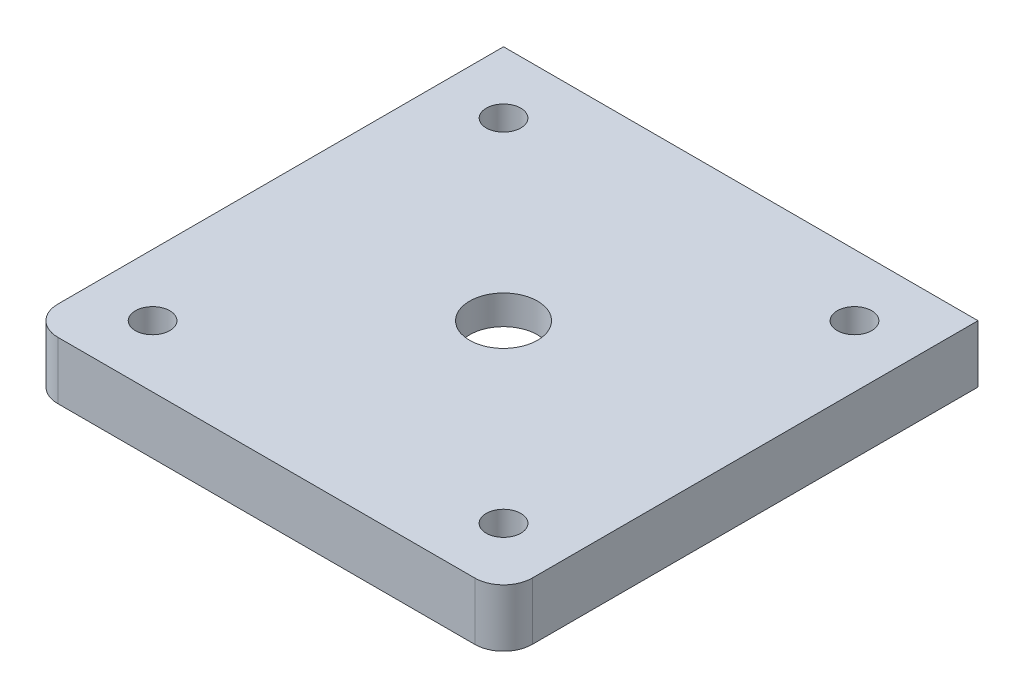
ISO-10303-21;
HEADER;
FILE_DESCRIPTION(('STEP AP214'),'2;1');
FILE_NAME('part.step','',(''),(''),'','','');
FILE_SCHEMA(('AUTOMOTIVE_DESIGN { 1 0 10303 214 1 1 1 1 }'));
ENDSEC;
DATA;
#1=APPLICATION_CONTEXT('core data for automotive mechanical design processes');
#2=APPLICATION_PROTOCOL_DEFINITION('international standard','automotive_design',2000,#1);
#3=PRODUCT_CONTEXT('',#1,'mechanical');
#4=PRODUCT('Part','Part','',(#3));
#5=PRODUCT_RELATED_PRODUCT_CATEGORY('part','',(#4));
#6=PRODUCT_DEFINITION_FORMATION('','',#4);
#7=PRODUCT_DEFINITION_CONTEXT('part definition',#1,'design');
#8=PRODUCT_DEFINITION('design','',#6,#7);
#9=PRODUCT_DEFINITION_SHAPE('','',#8);
#10=(LENGTH_UNIT() NAMED_UNIT(*) SI_UNIT(.MILLI.,.METRE.));
#11=(NAMED_UNIT(*) PLANE_ANGLE_UNIT() SI_UNIT($,.RADIAN.));
#12=(NAMED_UNIT(*) SI_UNIT($,.STERADIAN.) SOLID_ANGLE_UNIT());
#13=UNCERTAINTY_MEASURE_WITH_UNIT(LENGTH_MEASURE(1.E-05),#10,'distance_accuracy_value','');
#14=(GEOMETRIC_REPRESENTATION_CONTEXT(3) GLOBAL_UNCERTAINTY_ASSIGNED_CONTEXT((#13)) GLOBAL_UNIT_ASSIGNED_CONTEXT((#10,
#11,#12)) REPRESENTATION_CONTEXT('',''));
#15=CARTESIAN_POINT('',(0.,0.,0.));
#16=DIRECTION('',(0.,0.,1.));
#17=DIRECTION('',(1.,0.,0.));
#18=AXIS2_PLACEMENT_3D('',#15,#16,#17);
#19=CARTESIAN_POINT('',(0.,5.08,0.));
#20=DIRECTION('',(0.,1.,0.));
#21=DIRECTION('',(0.,0.,1.));
#22=AXIS2_PLACEMENT_3D('',#19,#20,#21);
#23=PLANE('',#22);
#24=DIRECTION('',(1.,0.,0.));
#25=VECTOR('',#24,1.);
#26=CARTESIAN_POINT('',(0.,5.08,-20.955));
#27=LINE('',#26,#25);
#28=CARTESIAN_POINT('',(-20.955,5.08,-20.955));
#29=VERTEX_POINT('',#28);
#30=CARTESIAN_POINT('',(20.955,5.08,-20.955));
#31=VERTEX_POINT('',#30);
#32=EDGE_CURVE('E93',#29,#31,#27,.T.);
#33=ORIENTED_EDGE('',*,*,#32,.F.);
#34=DIRECTION('',(0.,0.,1.));
#35=VECTOR('',#34,1.);
#36=CARTESIAN_POINT('',(-20.955,5.08,-20.955));
#37=LINE('',#36,#35);
#38=CARTESIAN_POINT('',(-20.955,5.08,18.415));
#39=VERTEX_POINT('',#38);
#40=EDGE_CURVE('E52',#29,#39,#37,.T.);
#41=ORIENTED_EDGE('',*,*,#40,.T.);
#42=CARTESIAN_POINT('',(-18.415,5.08,18.415));
#43=DIRECTION('',(0.,1.,0.));
#44=DIRECTION('',(0.,0.,1.));
#45=AXIS2_PLACEMENT_3D('',#42,#43,#44);
#46=CIRCLE('',#45,2.54);
#47=CARTESIAN_POINT('',(-18.415,5.08,20.955));
#48=VERTEX_POINT('',#47);
#49=EDGE_CURVE('E136',#39,#48,#46,.T.);
#50=ORIENTED_EDGE('',*,*,#49,.T.);
#51=DIRECTION('',(1.,0.,0.));
#52=VECTOR('',#51,1.);
#53=CARTESIAN_POINT('',(-20.955,5.08,20.955));
#54=LINE('',#53,#52);
#55=CARTESIAN_POINT('',(18.415,5.08,20.955));
#56=VERTEX_POINT('',#55);
#57=EDGE_CURVE('E110',#48,#56,#54,.T.);
#58=ORIENTED_EDGE('',*,*,#57,.T.);
#59=CARTESIAN_POINT('',(18.415,5.08,18.415));
#60=DIRECTION('',(0.,1.,0.));
#61=DIRECTION('',(0.,0.,1.));
#62=AXIS2_PLACEMENT_3D('',#59,#60,#61);
#63=CIRCLE('',#62,2.54);
#64=CARTESIAN_POINT('',(20.955,5.08,18.415));
#65=VERTEX_POINT('',#64);
#66=EDGE_CURVE('E45',#56,#65,#63,.T.);
#67=ORIENTED_EDGE('',*,*,#66,.T.);
#68=DIRECTION('',(0.,0.,-1.));
#69=VECTOR('',#68,1.);
#70=CARTESIAN_POINT('',(20.955,5.08,-20.955));
#71=LINE('',#70,#69);
#72=EDGE_CURVE('E104',#65,#31,#71,.T.);
#73=ORIENTED_EDGE('',*,*,#72,.T.);
#74=EDGE_LOOP('',(#33,#41,#50,#58,#67,#73));
#75=FACE_BOUND('',#74,.T.);
#76=CARTESIAN_POINT('',(0.,5.08,0.));
#77=DIRECTION('',(0.,-1.,0.));
#78=DIRECTION('',(0.,0.,-1.));
#79=AXIS2_PLACEMENT_3D('',#76,#77,#78);
#80=CIRCLE('',#79,3.);
#81=CARTESIAN_POINT('',(0.,5.08,-3.));
#82=VERTEX_POINT('',#81);
#83=EDGE_CURVE('E296',#82,#82,#80,.T.);
#84=ORIENTED_EDGE('',*,*,#83,.T.);
#85=EDGE_LOOP('',(#84));
#86=FACE_BOUND('',#85,.T.);
#87=CARTESIAN_POINT('',(15.5,5.08,15.5));
#88=DIRECTION('',(0.,1.,0.));
#89=DIRECTION('',(0.,0.,1.));
#90=AXIS2_PLACEMENT_3D('',#87,#88,#89);
#91=CIRCLE('',#90,1.52400000000001);
#92=CARTESIAN_POINT('',(15.5,5.08,17.024));
#93=VERTEX_POINT('',#92);
#94=EDGE_CURVE('E317',#93,#93,#91,.T.);
#95=ORIENTED_EDGE('',*,*,#94,.F.);
#96=EDGE_LOOP('',(#95));
#97=FACE_BOUND('',#96,.T.);
#98=CARTESIAN_POINT('',(-15.5,5.08,-15.5));
#99=DIRECTION('',(0.,1.,0.));
#100=DIRECTION('',(0.,0.,1.));
#101=AXIS2_PLACEMENT_3D('',#98,#99,#100);
#102=CIRCLE('',#101,1.524);
#103=CARTESIAN_POINT('',(-15.5,5.08,-13.976));
#104=VERTEX_POINT('',#103);
#105=EDGE_CURVE('E121',#104,#104,#102,.T.);
#106=ORIENTED_EDGE('',*,*,#105,.F.);
#107=EDGE_LOOP('',(#106));
#108=FACE_BOUND('',#107,.T.);
#109=CARTESIAN_POINT('',(15.5,5.08,-15.5));
#110=DIRECTION('',(0.,1.,0.));
#111=DIRECTION('',(0.,0.,-1.));
#112=AXIS2_PLACEMENT_3D('',#109,#110,#111);
#113=CIRCLE('',#112,1.52400000000001);
#114=CARTESIAN_POINT('',(15.5,5.08,-17.024));
#115=VERTEX_POINT('',#114);
#116=EDGE_CURVE('E323',#115,#115,#113,.T.);
#117=ORIENTED_EDGE('',*,*,#116,.F.);
#118=EDGE_LOOP('',(#117));
#119=FACE_BOUND('',#118,.T.);
#120=CARTESIAN_POINT('',(-15.5,5.08,15.5));
#121=DIRECTION('',(0.,1.,0.));
#122=DIRECTION('',(0.,0.,-1.));
#123=AXIS2_PLACEMENT_3D('',#120,#121,#122);
#124=CIRCLE('',#123,1.524);
#125=CARTESIAN_POINT('',(-15.5,5.08,13.976));
#126=VERTEX_POINT('',#125);
#127=EDGE_CURVE('E311',#126,#126,#124,.T.);
#128=ORIENTED_EDGE('',*,*,#127,.F.);
#129=EDGE_LOOP('',(#128));
#130=FACE_BOUND('',#129,.T.);
#131=ADVANCED_FACE('F37',(#75,#86,#97,#108,#119,#130),#23,.T.);
#132=CARTESIAN_POINT('',(0.,0.,0.));
#133=DIRECTION('',(0.,1.,0.));
#134=DIRECTION('',(0.,0.,1.));
#135=AXIS2_PLACEMENT_3D('',#132,#133,#134);
#136=PLANE('',#135);
#137=CARTESIAN_POINT('',(0.,0.,0.));
#138=DIRECTION('',(0.,-1.,0.));
#139=DIRECTION('',(0.,0.,-1.));
#140=AXIS2_PLACEMENT_3D('',#137,#138,#139);
#141=CIRCLE('',#140,11.5);
#142=CARTESIAN_POINT('',(0.,0.,-11.5));
#143=VERTEX_POINT('',#142);
#144=EDGE_CURVE('E301',#143,#143,#141,.T.);
#145=ORIENTED_EDGE('',*,*,#144,.F.);
#146=EDGE_LOOP('',(#145));
#147=FACE_BOUND('',#146,.T.);
#148=DIRECTION('',(0.,0.,-1.));
#149=VECTOR('',#148,1.);
#150=CARTESIAN_POINT('',(20.955,0.,-20.955));
#151=LINE('',#150,#149);
#152=CARTESIAN_POINT('',(20.955,0.,18.415));
#153=VERTEX_POINT('',#152);
#154=CARTESIAN_POINT('',(20.955,0.,-20.955));
#155=VERTEX_POINT('',#154);
#156=EDGE_CURVE('E118',#153,#155,#151,.T.);
#157=ORIENTED_EDGE('',*,*,#156,.F.);
#158=CARTESIAN_POINT('',(18.415,0.,18.415));
#159=DIRECTION('',(0.,1.,0.));
#160=DIRECTION('',(0.,0.,1.));
#161=AXIS2_PLACEMENT_3D('',#158,#159,#160);
#162=CIRCLE('',#161,2.54);
#163=CARTESIAN_POINT('',(18.415,0.,20.955));
#164=VERTEX_POINT('',#163);
#165=EDGE_CURVE('E130',#153,#164,#162,.F.);
#166=ORIENTED_EDGE('',*,*,#165,.T.);
#167=DIRECTION('',(1.,0.,0.));
#168=VECTOR('',#167,1.);
#169=CARTESIAN_POINT('',(-20.955,0.,20.955));
#170=LINE('',#169,#168);
#171=CARTESIAN_POINT('',(-18.415,0.,20.955));
#172=VERTEX_POINT('',#171);
#173=EDGE_CURVE('E114',#172,#164,#170,.T.);
#174=ORIENTED_EDGE('',*,*,#173,.F.);
#175=CARTESIAN_POINT('',(-18.415,0.,18.415));
#176=DIRECTION('',(0.,1.,0.));
#177=DIRECTION('',(0.,0.,1.));
#178=AXIS2_PLACEMENT_3D('',#175,#176,#177);
#179=CIRCLE('',#178,2.54);
#180=CARTESIAN_POINT('',(-20.955,0.,18.415));
#181=VERTEX_POINT('',#180);
#182=EDGE_CURVE('E128',#172,#181,#179,.F.);
#183=ORIENTED_EDGE('',*,*,#182,.T.);
#184=DIRECTION('',(0.,0.,1.));
#185=VECTOR('',#184,1.);
#186=CARTESIAN_POINT('',(-20.955,0.,-20.955));
#187=LINE('',#186,#185);
#188=CARTESIAN_POINT('',(-20.955,0.,-20.955));
#189=VERTEX_POINT('',#188);
#190=EDGE_CURVE('E123',#189,#181,#187,.T.);
#191=ORIENTED_EDGE('',*,*,#190,.F.);
#192=DIRECTION('',(-1.,0.,0.));
#193=VECTOR('',#192,1.);
#194=CARTESIAN_POINT('',(-20.955,0.,-20.955));
#195=LINE('',#194,#193);
#196=EDGE_CURVE('E96',#155,#189,#195,.T.);
#197=ORIENTED_EDGE('',*,*,#196,.F.);
#198=EDGE_LOOP('',(#157,#166,#174,#183,#191,#197));
#199=FACE_BOUND('',#198,.T.);
#200=CARTESIAN_POINT('',(-15.5,0.,-15.5));
#201=DIRECTION('',(0.,1.,0.));
#202=DIRECTION('',(0.,0.,1.));
#203=AXIS2_PLACEMENT_3D('',#200,#201,#202);
#204=CIRCLE('',#203,1.524);
#205=CARTESIAN_POINT('',(-15.5,0.,-13.976));
#206=VERTEX_POINT('',#205);
#207=EDGE_CURVE('E326',#206,#206,#204,.T.);
#208=ORIENTED_EDGE('',*,*,#207,.T.);
#209=EDGE_LOOP('',(#208));
#210=FACE_BOUND('',#209,.T.);
#211=CARTESIAN_POINT('',(15.5,0.,-15.5));
#212=DIRECTION('',(0.,1.,0.));
#213=DIRECTION('',(0.,0.,-1.));
#214=AXIS2_PLACEMENT_3D('',#211,#212,#213);
#215=CIRCLE('',#214,1.52400000000001);
#216=CARTESIAN_POINT('',(15.5,0.,-17.024));
#217=VERTEX_POINT('',#216);
#218=EDGE_CURVE('E320',#217,#217,#215,.T.);
#219=ORIENTED_EDGE('',*,*,#218,.T.);
#220=EDGE_LOOP('',(#219));
#221=FACE_BOUND('',#220,.T.);
#222=CARTESIAN_POINT('',(15.5,0.,15.5));
#223=DIRECTION('',(0.,1.,0.));
#224=DIRECTION('',(0.,0.,1.));
#225=AXIS2_PLACEMENT_3D('',#222,#223,#224);
#226=CIRCLE('',#225,1.52400000000001);
#227=CARTESIAN_POINT('',(15.5,0.,17.024));
#228=VERTEX_POINT('',#227);
#229=EDGE_CURVE('E314',#228,#228,#226,.T.);
#230=ORIENTED_EDGE('',*,*,#229,.T.);
#231=EDGE_LOOP('',(#230));
#232=FACE_BOUND('',#231,.T.);
#233=CARTESIAN_POINT('',(-15.5,0.,15.5));
#234=DIRECTION('',(0.,1.,0.));
#235=DIRECTION('',(0.,0.,-1.));
#236=AXIS2_PLACEMENT_3D('',#233,#234,#235);
#237=CIRCLE('',#236,1.524);
#238=CARTESIAN_POINT('',(-15.5,0.,13.976));
#239=VERTEX_POINT('',#238);
#240=EDGE_CURVE('E308',#239,#239,#237,.T.);
#241=ORIENTED_EDGE('',*,*,#240,.T.);
#242=EDGE_LOOP('',(#241));
#243=FACE_BOUND('',#242,.T.);
#244=ADVANCED_FACE('F146',(#147,#199,#210,#221,#232,#243),#136,.F.);
#245=CARTESIAN_POINT('',(20.955,5.08,-20.955));
#246=DIRECTION('',(-1.,0.,0.));
#247=DIRECTION('',(0.,0.,1.));
#248=AXIS2_PLACEMENT_3D('',#245,#246,#247);
#249=PLANE('',#248);
#250=ORIENTED_EDGE('',*,*,#156,.T.);
#251=DIRECTION('',(0.,1.,0.));
#252=VECTOR('',#251,1.);
#253=CARTESIAN_POINT('',(20.955,5.08,-20.955));
#254=LINE('',#253,#252);
#255=EDGE_CURVE('E105',#155,#31,#254,.T.);
#256=ORIENTED_EDGE('',*,*,#255,.T.);
#257=ORIENTED_EDGE('',*,*,#72,.F.);
#258=DIRECTION('',(0.,-1.,0.));
#259=VECTOR('',#258,1.);
#260=CARTESIAN_POINT('',(20.955,5.08,18.415));
#261=LINE('',#260,#259);
#262=EDGE_CURVE('E112',#65,#153,#261,.T.);
#263=ORIENTED_EDGE('',*,*,#262,.T.);
#264=EDGE_LOOP('',(#250,#256,#257,#263));
#265=FACE_BOUND('',#264,.T.);
#266=ADVANCED_FACE('F141',(#265),#249,.F.);
#267=CARTESIAN_POINT('',(-20.955,5.08,-20.955));
#268=DIRECTION('',(1.,0.,0.));
#269=DIRECTION('',(0.,0.,-1.));
#270=AXIS2_PLACEMENT_3D('',#267,#268,#269);
#271=PLANE('',#270);
#272=ORIENTED_EDGE('',*,*,#40,.F.);
#273=DIRECTION('',(0.,-1.,0.));
#274=VECTOR('',#273,1.);
#275=CARTESIAN_POINT('',(-20.955,5.08,-20.955));
#276=LINE('',#275,#274);
#277=EDGE_CURVE('E91',#29,#189,#276,.T.);
#278=ORIENTED_EDGE('',*,*,#277,.T.);
#279=ORIENTED_EDGE('',*,*,#190,.T.);
#280=DIRECTION('',(0.,-1.,0.));
#281=VECTOR('',#280,1.);
#282=CARTESIAN_POINT('',(-20.955,5.08,18.415));
#283=LINE('',#282,#281);
#284=EDGE_CURVE('E11',#181,#39,#283,.F.);
#285=ORIENTED_EDGE('',*,*,#284,.T.);
#286=EDGE_LOOP('',(#272,#278,#279,#285));
#287=FACE_BOUND('',#286,.T.);
#288=ADVANCED_FACE('F107',(#287),#271,.F.);
#289=CARTESIAN_POINT('',(-20.955,5.08,20.955));
#290=DIRECTION('',(0.,0.,-1.));
#291=DIRECTION('',(-1.,0.,0.));
#292=AXIS2_PLACEMENT_3D('',#289,#290,#291);
#293=PLANE('',#292);
#294=ORIENTED_EDGE('',*,*,#173,.T.);
#295=DIRECTION('',(0.,-1.,0.));
#296=VECTOR('',#295,1.);
#297=CARTESIAN_POINT('',(18.415,5.08,20.955));
#298=LINE('',#297,#296);
#299=EDGE_CURVE('E59',#164,#56,#298,.F.);
#300=ORIENTED_EDGE('',*,*,#299,.T.);
#301=ORIENTED_EDGE('',*,*,#57,.F.);
#302=DIRECTION('',(0.,-1.,0.));
#303=VECTOR('',#302,1.);
#304=CARTESIAN_POINT('',(-18.415,5.08,20.955));
#305=LINE('',#304,#303);
#306=EDGE_CURVE('E132',#48,#172,#305,.T.);
#307=ORIENTED_EDGE('',*,*,#306,.T.);
#308=EDGE_LOOP('',(#294,#300,#301,#307));
#309=FACE_BOUND('',#308,.T.);
#310=ADVANCED_FACE('F148',(#309),#293,.F.);
#311=CARTESIAN_POINT('',(-15.5,5.08,-15.5));
#312=DIRECTION('',(0.,-1.,0.));
#313=DIRECTION('',(0.,0.,-1.));
#314=AXIS2_PLACEMENT_3D('',#311,#312,#313);
#315=CYLINDRICAL_SURFACE('',#314,1.524);
#316=ORIENTED_EDGE('',*,*,#105,.T.);
#317=EDGE_LOOP('',(#316));
#318=FACE_BOUND('',#317,.T.);
#319=ORIENTED_EDGE('',*,*,#207,.F.);
#320=EDGE_LOOP('',(#319));
#321=FACE_BOUND('',#320,.T.);
#322=ADVANCED_FACE('F166',(#318,#321),#315,.F.);
#323=CARTESIAN_POINT('',(15.5,5.08,-15.5));
#324=DIRECTION('',(0.,-1.,0.));
#325=DIRECTION('',(0.,0.,-1.));
#326=AXIS2_PLACEMENT_3D('',#323,#324,#325);
#327=CYLINDRICAL_SURFACE('',#326,1.52400000000001);
#328=ORIENTED_EDGE('',*,*,#116,.T.);
#329=EDGE_LOOP('',(#328));
#330=FACE_BOUND('',#329,.T.);
#331=ORIENTED_EDGE('',*,*,#218,.F.);
#332=EDGE_LOOP('',(#331));
#333=FACE_BOUND('',#332,.T.);
#334=ADVANCED_FACE('F195',(#330,#333),#327,.F.);
#335=CARTESIAN_POINT('',(15.5,5.08,15.5));
#336=DIRECTION('',(0.,-1.,0.));
#337=DIRECTION('',(0.,0.,-1.));
#338=AXIS2_PLACEMENT_3D('',#335,#336,#337);
#339=CYLINDRICAL_SURFACE('',#338,1.52400000000001);
#340=ORIENTED_EDGE('',*,*,#94,.T.);
#341=EDGE_LOOP('',(#340));
#342=FACE_BOUND('',#341,.T.);
#343=ORIENTED_EDGE('',*,*,#229,.F.);
#344=EDGE_LOOP('',(#343));
#345=FACE_BOUND('',#344,.T.);
#346=ADVANCED_FACE('F202',(#342,#345),#339,.F.);
#347=CARTESIAN_POINT('',(-15.5,5.08,15.5));
#348=DIRECTION('',(0.,-1.,0.));
#349=DIRECTION('',(0.,0.,-1.));
#350=AXIS2_PLACEMENT_3D('',#347,#348,#349);
#351=CYLINDRICAL_SURFACE('',#350,1.524);
#352=ORIENTED_EDGE('',*,*,#127,.T.);
#353=EDGE_LOOP('',(#352));
#354=FACE_BOUND('',#353,.T.);
#355=ORIENTED_EDGE('',*,*,#240,.F.);
#356=EDGE_LOOP('',(#355));
#357=FACE_BOUND('',#356,.T.);
#358=ADVANCED_FACE('F209',(#354,#357),#351,.F.);
#359=CARTESIAN_POINT('',(0.,2.5,0.));
#360=DIRECTION('',(0.,-1.,0.));
#361=DIRECTION('',(0.,0.,-1.));
#362=AXIS2_PLACEMENT_3D('',#359,#360,#361);
#363=CYLINDRICAL_SURFACE('',#362,11.5);
#364=CARTESIAN_POINT('',(0.,2.5,0.));
#365=DIRECTION('',(0.,-1.,0.));
#366=DIRECTION('',(0.,0.,-1.));
#367=AXIS2_PLACEMENT_3D('',#364,#365,#366);
#368=CIRCLE('',#367,11.5);
#369=CARTESIAN_POINT('',(0.,2.5,-11.5));
#370=VERTEX_POINT('',#369);
#371=EDGE_CURVE('E305',#370,#370,#368,.T.);
#372=ORIENTED_EDGE('',*,*,#371,.F.);
#373=EDGE_LOOP('',(#372));
#374=FACE_BOUND('',#373,.T.);
#375=ORIENTED_EDGE('',*,*,#144,.T.);
#376=EDGE_LOOP('',(#375));
#377=FACE_BOUND('',#376,.T.);
#378=ADVANCED_FACE('F217',(#374,#377),#363,.F.);
#379=CARTESIAN_POINT('',(0.,2.5,0.));
#380=DIRECTION('',(0.,-1.,0.));
#381=DIRECTION('',(0.,0.,-1.));
#382=AXIS2_PLACEMENT_3D('',#379,#380,#381);
#383=PLANE('',#382);
#384=CARTESIAN_POINT('',(0.,2.5,0.));
#385=DIRECTION('',(0.,-1.,0.));
#386=DIRECTION('',(0.,0.,-1.));
#387=AXIS2_PLACEMENT_3D('',#384,#385,#386);
#388=CIRCLE('',#387,3.);
#389=CARTESIAN_POINT('',(0.,2.5,-3.));
#390=VERTEX_POINT('',#389);
#391=EDGE_CURVE('E299',#390,#390,#388,.T.);
#392=ORIENTED_EDGE('',*,*,#391,.F.);
#393=EDGE_LOOP('',(#392));
#394=FACE_BOUND('',#393,.T.);
#395=ORIENTED_EDGE('',*,*,#371,.T.);
#396=EDGE_LOOP('',(#395));
#397=FACE_BOUND('',#396,.T.);
#398=ADVANCED_FACE('F225',(#394,#397),#383,.T.);
#399=CARTESIAN_POINT('',(0.,5.08,0.));
#400=DIRECTION('',(0.,-1.,0.));
#401=DIRECTION('',(0.,0.,-1.));
#402=AXIS2_PLACEMENT_3D('',#399,#400,#401);
#403=CYLINDRICAL_SURFACE('',#402,3.);
#404=ORIENTED_EDGE('',*,*,#83,.F.);
#405=EDGE_LOOP('',(#404));
#406=FACE_BOUND('',#405,.T.);
#407=ORIENTED_EDGE('',*,*,#391,.T.);
#408=EDGE_LOOP('',(#407));
#409=FACE_BOUND('',#408,.T.);
#410=ADVANCED_FACE('F157',(#406,#409),#403,.F.);
#411=CARTESIAN_POINT('',(18.415,5.08,18.415));
#412=DIRECTION('',(0.,-1.,0.));
#413=DIRECTION('',(0.,0.,-1.));
#414=AXIS2_PLACEMENT_3D('',#411,#412,#413);
#415=CYLINDRICAL_SURFACE('',#414,2.54);
#416=ORIENTED_EDGE('',*,*,#66,.F.);
#417=ORIENTED_EDGE('',*,*,#299,.F.);
#418=ORIENTED_EDGE('',*,*,#165,.F.);
#419=ORIENTED_EDGE('',*,*,#262,.F.);
#420=EDGE_LOOP('',(#416,#417,#418,#419));
#421=FACE_BOUND('',#420,.T.);
#422=ADVANCED_FACE('F143',(#421),#415,.T.);
#423=CARTESIAN_POINT('',(-18.415,5.08,18.415));
#424=DIRECTION('',(0.,-1.,0.));
#425=DIRECTION('',(0.,0.,-1.));
#426=AXIS2_PLACEMENT_3D('',#423,#424,#425);
#427=CYLINDRICAL_SURFACE('',#426,2.54);
#428=ORIENTED_EDGE('',*,*,#49,.F.);
#429=ORIENTED_EDGE('',*,*,#284,.F.);
#430=ORIENTED_EDGE('',*,*,#182,.F.);
#431=ORIENTED_EDGE('',*,*,#306,.F.);
#432=EDGE_LOOP('',(#428,#429,#430,#431));
#433=FACE_BOUND('',#432,.T.);
#434=ADVANCED_FACE('F39',(#433),#427,.T.);
#435=CARTESIAN_POINT('',(0.,0.,-20.955));
#436=DIRECTION('',(0.,0.,1.));
#437=DIRECTION('',(1.,0.,0.));
#438=AXIS2_PLACEMENT_3D('',#435,#436,#437);
#439=PLANE('',#438);
#440=ORIENTED_EDGE('',*,*,#196,.T.);
#441=ORIENTED_EDGE('',*,*,#277,.F.);
#442=ORIENTED_EDGE('',*,*,#32,.T.);
#443=ORIENTED_EDGE('',*,*,#255,.F.);
#444=EDGE_LOOP('',(#440,#441,#442,#443));
#445=FACE_BOUND('',#444,.T.);
#446=ADVANCED_FACE('F92',(#445),#439,.F.);
#447=CLOSED_SHELL('',(#131,#244,#266,#288,#310,#322,#334,#346,#358,#378,#398,#410,#422,#434,#446));
#448=MANIFOLD_SOLID_BREP('B2',#447);
#449=ADVANCED_BREP_SHAPE_REPRESENTATION('',(#18,#448),#14);
#450=SHAPE_DEFINITION_REPRESENTATION(#9,#449);
ENDSEC;
END-ISO-10303-21;
